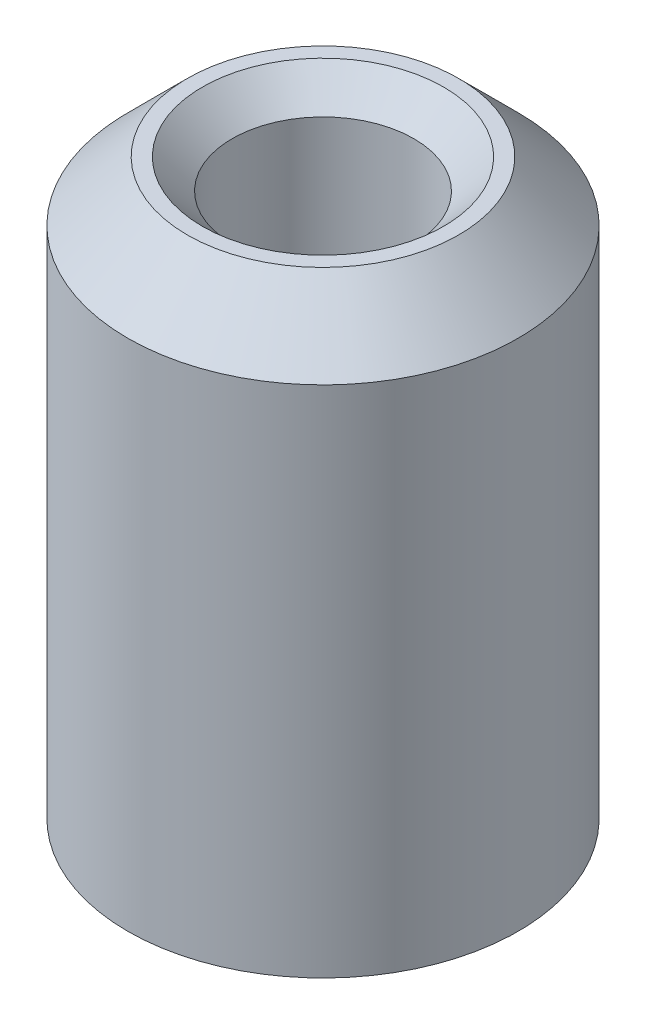
ISO-10303-21;
HEADER;
FILE_DESCRIPTION(('STEP AP214'),'2;1');
FILE_NAME('part.step','',(''),(''),'','','');
FILE_SCHEMA(('AUTOMOTIVE_DESIGN { 1 0 10303 214 1 1 1 1 }'));
ENDSEC;
DATA;
#1=APPLICATION_CONTEXT('core data for automotive mechanical design processes');
#2=APPLICATION_PROTOCOL_DEFINITION('international standard','automotive_design',2000,#1);
#3=PRODUCT_CONTEXT('',#1,'mechanical');
#4=PRODUCT('Part','Part','',(#3));
#5=PRODUCT_RELATED_PRODUCT_CATEGORY('part','',(#4));
#6=PRODUCT_DEFINITION_FORMATION('','',#4);
#7=PRODUCT_DEFINITION_CONTEXT('part definition',#1,'design');
#8=PRODUCT_DEFINITION('design','',#6,#7);
#9=PRODUCT_DEFINITION_SHAPE('','',#8);
#10=(LENGTH_UNIT() NAMED_UNIT(*) SI_UNIT(.MILLI.,.METRE.));
#11=(NAMED_UNIT(*) PLANE_ANGLE_UNIT() SI_UNIT($,.RADIAN.));
#12=(NAMED_UNIT(*) SI_UNIT($,.STERADIAN.) SOLID_ANGLE_UNIT());
#13=UNCERTAINTY_MEASURE_WITH_UNIT(LENGTH_MEASURE(1.E-05),#10,'distance_accuracy_value','');
#14=(GEOMETRIC_REPRESENTATION_CONTEXT(3) GLOBAL_UNCERTAINTY_ASSIGNED_CONTEXT((#13)) GLOBAL_UNIT_ASSIGNED_CONTEXT((#10,
#11,#12)) REPRESENTATION_CONTEXT('',''));
#15=CARTESIAN_POINT('',(0.,0.,0.));
#16=DIRECTION('',(0.,0.,1.));
#17=DIRECTION('',(1.,0.,0.));
#18=AXIS2_PLACEMENT_3D('',#15,#16,#17);
#19=CARTESIAN_POINT('',(0.,19.24,0.));
#20=DIRECTION('',(0.,1.,0.));
#21=DIRECTION('',(0.,0.,1.));
#22=AXIS2_PLACEMENT_3D('',#19,#20,#21);
#23=PLANE('',#22);
#24=CARTESIAN_POINT('',(0.,19.24,0.));
#25=DIRECTION('',(0.,1.,0.));
#26=DIRECTION('',(0.,0.,1.));
#27=AXIS2_PLACEMENT_3D('',#24,#25,#26);
#28=CIRCLE('',#27,4.05000000000001);
#29=CARTESIAN_POINT('',(0.,19.24,4.05000000000001));
#30=VERTEX_POINT('',#29);
#31=EDGE_CURVE('E10',#30,#30,#28,.F.);
#32=ORIENTED_EDGE('',*,*,#31,.T.);
#33=EDGE_LOOP('',(#32));
#34=FACE_BOUND('',#33,.T.);
#35=CARTESIAN_POINT('',(0.,19.24,0.));
#36=DIRECTION('',(0.,1.,0.));
#37=DIRECTION('',(0.,0.,1.));
#38=AXIS2_PLACEMENT_3D('',#35,#36,#37);
#39=CIRCLE('',#38,4.55320000000001);
#40=CARTESIAN_POINT('',(0.,19.24,4.55320000000001));
#41=VERTEX_POINT('',#40);
#42=EDGE_CURVE('E47',#41,#41,#39,.T.);
#43=ORIENTED_EDGE('',*,*,#42,.T.);
#44=EDGE_LOOP('',(#43));
#45=FACE_BOUND('',#44,.T.);
#46=ADVANCED_FACE('F32',(#34,#45),#23,.T.);
#47=CARTESIAN_POINT('',(0.,0.,0.));
#48=DIRECTION('',(0.,1.,0.));
#49=DIRECTION('',(0.,0.,1.));
#50=AXIS2_PLACEMENT_3D('',#47,#48,#49);
#51=PLANE('',#50);
#52=CARTESIAN_POINT('',(0.,0.,0.));
#53=DIRECTION('',(0.,1.,0.));
#54=DIRECTION('',(0.,0.,1.));
#55=AXIS2_PLACEMENT_3D('',#52,#53,#54);
#56=CIRCLE('',#55,6.5532);
#57=CARTESIAN_POINT('',(0.,0.,6.5532));
#58=VERTEX_POINT('',#57);
#59=EDGE_CURVE('E52',#58,#58,#56,.T.);
#60=ORIENTED_EDGE('',*,*,#59,.F.);
#61=EDGE_LOOP('',(#60));
#62=FACE_BOUND('',#61,.T.);
#63=CARTESIAN_POINT('',(0.,0.,0.));
#64=DIRECTION('',(0.,1.,0.));
#65=DIRECTION('',(0.,0.,1.));
#66=AXIS2_PLACEMENT_3D('',#63,#64,#65);
#67=CIRCLE('',#66,3.05);
#68=CARTESIAN_POINT('',(0.,0.,3.05));
#69=VERTEX_POINT('',#68);
#70=EDGE_CURVE('E55',#69,#69,#67,.T.);
#71=ORIENTED_EDGE('',*,*,#70,.T.);
#72=EDGE_LOOP('',(#71));
#73=FACE_BOUND('',#72,.T.);
#74=ADVANCED_FACE('F59',(#62,#73),#51,.F.);
#75=CARTESIAN_POINT('',(0.,19.24,0.));
#76=DIRECTION('',(0.,-1.,0.));
#77=DIRECTION('',(0.,0.,-1.));
#78=AXIS2_PLACEMENT_3D('',#75,#76,#77);
#79=CYLINDRICAL_SURFACE('',#78,6.5532);
#80=CARTESIAN_POINT('',(0.,17.24,0.));
#81=DIRECTION('',(0.,1.,0.));
#82=DIRECTION('',(0.,0.,1.));
#83=AXIS2_PLACEMENT_3D('',#80,#81,#82);
#84=CIRCLE('',#83,6.5532);
#85=CARTESIAN_POINT('',(0.,17.24,6.5532));
#86=VERTEX_POINT('',#85);
#87=EDGE_CURVE('E43',#86,#86,#84,.F.);
#88=ORIENTED_EDGE('',*,*,#87,.T.);
#89=EDGE_LOOP('',(#88));
#90=FACE_BOUND('',#89,.T.);
#91=ORIENTED_EDGE('',*,*,#59,.T.);
#92=EDGE_LOOP('',(#91));
#93=FACE_BOUND('',#92,.T.);
#94=ADVANCED_FACE('F64',(#90,#93),#79,.T.);
#95=CARTESIAN_POINT('',(0.,19.24,0.));
#96=DIRECTION('',(0.,-1.,0.));
#97=DIRECTION('',(0.,0.,-1.));
#98=AXIS2_PLACEMENT_3D('',#95,#96,#97);
#99=CYLINDRICAL_SURFACE('',#98,3.05);
#100=CARTESIAN_POINT('',(0.,18.24,0.));
#101=DIRECTION('',(0.,1.,0.));
#102=DIRECTION('',(0.,0.,1.));
#103=AXIS2_PLACEMENT_3D('',#100,#101,#102);
#104=CIRCLE('',#103,3.05);
#105=CARTESIAN_POINT('',(0.,18.24,3.05));
#106=VERTEX_POINT('',#105);
#107=EDGE_CURVE('E39',#106,#106,#104,.T.);
#108=ORIENTED_EDGE('',*,*,#107,.T.);
#109=EDGE_LOOP('',(#108));
#110=FACE_BOUND('',#109,.T.);
#111=ORIENTED_EDGE('',*,*,#70,.F.);
#112=EDGE_LOOP('',(#111));
#113=FACE_BOUND('',#112,.T.);
#114=ADVANCED_FACE('F61',(#110,#113),#99,.F.);
#115=CARTESIAN_POINT('',(0.,19.24,0.));
#116=DIRECTION('',(0.,-1.,0.));
#117=DIRECTION('',(0.,0.,-1.));
#118=AXIS2_PLACEMENT_3D('',#115,#116,#117);
#119=CONICAL_SURFACE('',#118,4.55320000000001,0.785398163397446);
#120=ORIENTED_EDGE('',*,*,#87,.F.);
#121=EDGE_LOOP('',(#120));
#122=FACE_BOUND('',#121,.T.);
#123=ORIENTED_EDGE('',*,*,#42,.F.);
#124=EDGE_LOOP('',(#123));
#125=FACE_BOUND('',#124,.T.);
#126=ADVANCED_FACE('F63',(#122,#125),#119,.T.);
#127=CARTESIAN_POINT('',(0.,18.24,0.));
#128=DIRECTION('',(0.,1.,0.));
#129=DIRECTION('',(0.,0.,1.));
#130=AXIS2_PLACEMENT_3D('',#127,#128,#129);
#131=CONICAL_SURFACE('',#130,3.05,0.78539816339745);
#132=ORIENTED_EDGE('',*,*,#31,.F.);
#133=EDGE_LOOP('',(#132));
#134=FACE_BOUND('',#133,.T.);
#135=ORIENTED_EDGE('',*,*,#107,.F.);
#136=EDGE_LOOP('',(#135));
#137=FACE_BOUND('',#136,.T.);
#138=ADVANCED_FACE('F34',(#134,#137),#131,.F.);
#139=CLOSED_SHELL('',(#46,#74,#94,#114,#126,#138));
#140=MANIFOLD_SOLID_BREP('B2',#139);
#141=ADVANCED_BREP_SHAPE_REPRESENTATION('',(#18,#140),#14);
#142=SHAPE_DEFINITION_REPRESENTATION(#9,#141);
ENDSEC;
END-ISO-10303-21;
